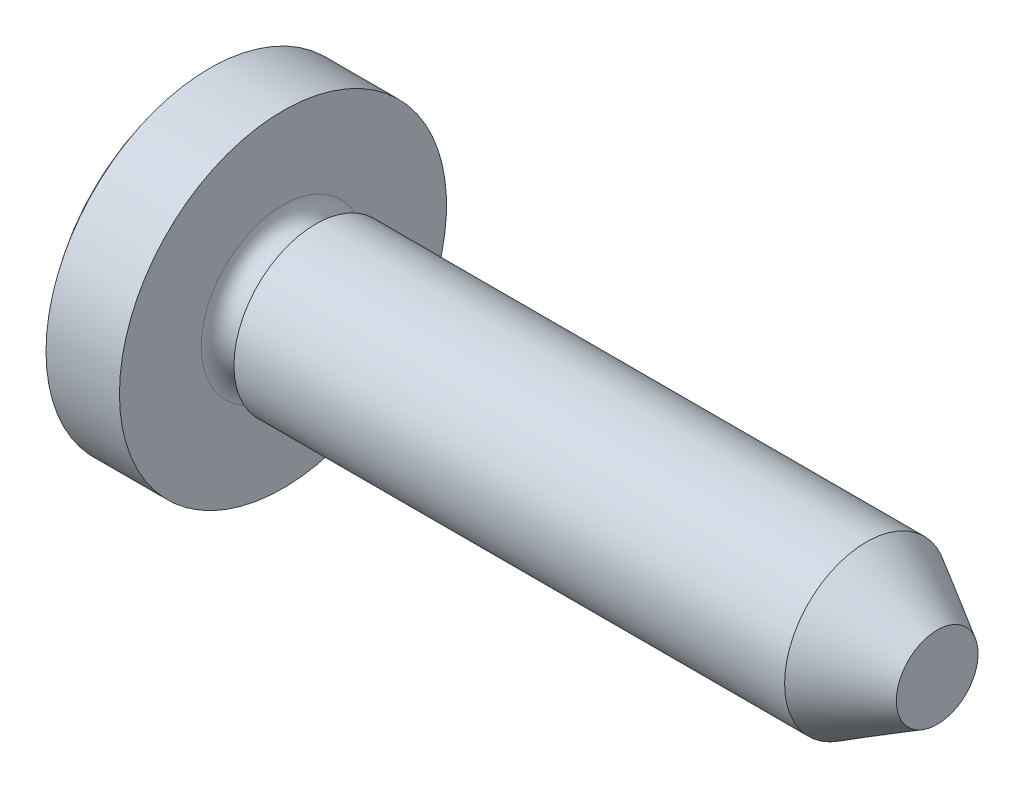
ISO-10303-21;
HEADER;
FILE_DESCRIPTION(('STEP AP214'),'2;1');
FILE_NAME('part.step','',(''),(''),'','','');
FILE_SCHEMA(('AUTOMOTIVE_DESIGN { 1 0 10303 214 1 1 1 1 }'));
ENDSEC;
DATA;
#1=APPLICATION_CONTEXT('core data for automotive mechanical design processes');
#2=APPLICATION_PROTOCOL_DEFINITION('international standard','automotive_design',2000,#1);
#3=PRODUCT_CONTEXT('',#1,'mechanical');
#4=PRODUCT('Part','Part','',(#3));
#5=PRODUCT_RELATED_PRODUCT_CATEGORY('part','',(#4));
#6=PRODUCT_DEFINITION_FORMATION('','',#4);
#7=PRODUCT_DEFINITION_CONTEXT('part definition',#1,'design');
#8=PRODUCT_DEFINITION('design','',#6,#7);
#9=PRODUCT_DEFINITION_SHAPE('','',#8);
#10=(LENGTH_UNIT() NAMED_UNIT(*) SI_UNIT(.MILLI.,.METRE.));
#11=(NAMED_UNIT(*) PLANE_ANGLE_UNIT() SI_UNIT($,.RADIAN.));
#12=(NAMED_UNIT(*) SI_UNIT($,.STERADIAN.) SOLID_ANGLE_UNIT());
#13=UNCERTAINTY_MEASURE_WITH_UNIT(LENGTH_MEASURE(1.E-05),#10,'distance_accuracy_value','');
#14=(GEOMETRIC_REPRESENTATION_CONTEXT(3) GLOBAL_UNCERTAINTY_ASSIGNED_CONTEXT((#13)) GLOBAL_UNIT_ASSIGNED_CONTEXT((#10,
#11,#12)) REPRESENTATION_CONTEXT('',''));
#15=CARTESIAN_POINT('',(0.,0.,0.));
#16=DIRECTION('',(0.,0.,1.));
#17=DIRECTION('',(1.,0.,0.));
#18=AXIS2_PLACEMENT_3D('',#15,#16,#17);
#19=CARTESIAN_POINT('',(0.9,-0.190000000000001,-0.190000000000001));
#20=DIRECTION('',(-1.,0.,0.));
#21=DIRECTION('',(0.,0.,1.));
#22=AXIS2_PLACEMENT_3D('',#19,#20,#21);
#23=PLANE('',#22);
#24=DIRECTION('',(0.,1.,0.));
#25=VECTOR('',#24,1.);
#26=CARTESIAN_POINT('',(0.9,0.,0.430384757729334));
#27=LINE('',#26,#25);
#28=CARTESIAN_POINT('',(0.9,0.189999999999999,0.430384757729334));
#29=VERTEX_POINT('',#28);
#30=CARTESIAN_POINT('',(0.9,-0.190000000000001,0.430384757729334));
#31=VERTEX_POINT('',#30);
#32=EDGE_CURVE('E121',#29,#31,#27,.F.);
#33=ORIENTED_EDGE('',*,*,#32,.F.);
#34=DIRECTION('',(0.,0.,-1.));
#35=VECTOR('',#34,1.);
#36=CARTESIAN_POINT('',(0.9,0.189999999999999,0.189999999999999));
#37=LINE('',#36,#35);
#38=CARTESIAN_POINT('',(0.9,0.189999999999999,0.189999999999999));
#39=VERTEX_POINT('',#38);
#40=EDGE_CURVE('E123',#39,#29,#37,.F.);
#41=ORIENTED_EDGE('',*,*,#40,.F.);
#42=DIRECTION('',(0.,1.,0.));
#43=VECTOR('',#42,1.);
#44=CARTESIAN_POINT('',(0.9,0.949999999999999,0.189999999999999));
#45=LINE('',#44,#43);
#46=CARTESIAN_POINT('',(0.9,0.430384757729334,0.189999999999999));
#47=VERTEX_POINT('',#46);
#48=EDGE_CURVE('E158',#47,#39,#45,.F.);
#49=ORIENTED_EDGE('',*,*,#48,.F.);
#50=DIRECTION('',(0.,0.,1.));
#51=VECTOR('',#50,1.);
#52=CARTESIAN_POINT('',(0.9,0.430384757729334,0.));
#53=LINE('',#52,#51);
#54=CARTESIAN_POINT('',(0.9,0.430384757729334,-0.190000000000001));
#55=VERTEX_POINT('',#54);
#56=EDGE_CURVE('E164',#55,#47,#53,.T.);
#57=ORIENTED_EDGE('',*,*,#56,.F.);
#58=DIRECTION('',(0.,-1.,0.));
#59=VECTOR('',#58,1.);
#60=CARTESIAN_POINT('',(0.9,0.949999999999999,-0.190000000000001));
#61=LINE('',#60,#59);
#62=CARTESIAN_POINT('',(0.9,0.189999999999999,-0.190000000000001));
#63=VERTEX_POINT('',#62);
#64=EDGE_CURVE('E170',#63,#55,#61,.F.);
#65=ORIENTED_EDGE('',*,*,#64,.F.);
#66=DIRECTION('',(0.,0.,-1.));
#67=VECTOR('',#66,1.);
#68=CARTESIAN_POINT('',(0.9,0.189999999999999,-0.190000000000001));
#69=LINE('',#68,#67);
#70=CARTESIAN_POINT('',(0.9,0.189999999999999,-0.430384757729336));
#71=VERTEX_POINT('',#70);
#72=EDGE_CURVE('E176',#71,#63,#69,.F.);
#73=ORIENTED_EDGE('',*,*,#72,.F.);
#74=DIRECTION('',(0.,1.,0.));
#75=VECTOR('',#74,1.);
#76=CARTESIAN_POINT('',(0.9,0.,-0.430384757729336));
#77=LINE('',#76,#75);
#78=CARTESIAN_POINT('',(0.9,-0.190000000000001,-0.430384757729336));
#79=VERTEX_POINT('',#78);
#80=EDGE_CURVE('E182',#79,#71,#77,.T.);
#81=ORIENTED_EDGE('',*,*,#80,.F.);
#82=DIRECTION('',(0.,0.,1.));
#83=VECTOR('',#82,1.);
#84=CARTESIAN_POINT('',(0.9,-0.190000000000001,-0.190000000000001));
#85=LINE('',#84,#83);
#86=CARTESIAN_POINT('',(0.9,-0.190000000000001,-0.190000000000001));
#87=VERTEX_POINT('',#86);
#88=EDGE_CURVE('E188',#87,#79,#85,.F.);
#89=ORIENTED_EDGE('',*,*,#88,.F.);
#90=DIRECTION('',(0.,1.,0.));
#91=VECTOR('',#90,1.);
#92=CARTESIAN_POINT('',(0.9,-0.95,-0.190000000000001));
#93=LINE('',#92,#91);
#94=CARTESIAN_POINT('',(0.9,-0.430384757729336,-0.190000000000001));
#95=VERTEX_POINT('',#94);
#96=EDGE_CURVE('E194',#95,#87,#93,.T.);
#97=ORIENTED_EDGE('',*,*,#96,.F.);
#98=DIRECTION('',(0.,0.,1.));
#99=VECTOR('',#98,1.);
#100=CARTESIAN_POINT('',(0.9,-0.430384757729336,0.));
#101=LINE('',#100,#99);
#102=CARTESIAN_POINT('',(0.9,-0.430384757729336,0.189999999999999));
#103=VERTEX_POINT('',#102);
#104=EDGE_CURVE('E200',#103,#95,#101,.F.);
#105=ORIENTED_EDGE('',*,*,#104,.F.);
#106=DIRECTION('',(0.,1.,0.));
#107=VECTOR('',#106,1.);
#108=CARTESIAN_POINT('',(0.9,-0.95,0.189999999999999));
#109=LINE('',#108,#107);
#110=CARTESIAN_POINT('',(0.9,-0.190000000000001,0.189999999999999));
#111=VERTEX_POINT('',#110);
#112=EDGE_CURVE('E89',#111,#103,#109,.F.);
#113=ORIENTED_EDGE('',*,*,#112,.F.);
#114=DIRECTION('',(0.,0.,1.));
#115=VECTOR('',#114,1.);
#116=CARTESIAN_POINT('',(0.9,-0.190000000000001,0.189999999999999));
#117=LINE('',#116,#115);
#118=EDGE_CURVE('E126',#31,#111,#117,.F.);
#119=ORIENTED_EDGE('',*,*,#118,.F.);
#120=EDGE_LOOP('',(#33,#41,#49,#57,#65,#73,#81,#89,#97,#105,#113,#119));
#121=FACE_BOUND('',#120,.T.);
#122=ADVANCED_FACE('F17',(#121),#23,.T.);
#123=CARTESIAN_POINT('',(0.9,-0.95,0.189999999999999));
#124=DIRECTION('',(0.,0.,-1.));
#125=DIRECTION('',(0.,1.,0.));
#126=AXIS2_PLACEMENT_3D('',#123,#124,#125);
#127=PLANE('',#126);
#128=CARTESIAN_POINT('',(3.2,0.,0.189999999999999));
#129=DIRECTION('',(0.,0.,-1.));
#130=DIRECTION('',(0.,1.,0.));
#131=AXIS2_PLACEMENT_3D('',#128,#129,#130);
#132=CIRCLE('',#131,3.19435439486604);
#133=CARTESIAN_POINT('',(0.0113012058207825,-0.190000000000001,0.189999999999999));
#134=VERTEX_POINT('',#133);
#135=CARTESIAN_POINT('',(0.128116518841079,-0.876031893359466,0.189999999999999));
#136=VERTEX_POINT('',#135);
#137=EDGE_CURVE('E21',#134,#136,#132,.F.);
#138=ORIENTED_EDGE('',*,*,#137,.F.);
#139=DIRECTION('',(1.,0.,0.));
#140=VECTOR('',#139,1.);
#141=CARTESIAN_POINT('',(0.9,-0.190000000000001,0.189999999999999));
#142=LINE('',#141,#140);
#143=EDGE_CURVE('E145',#111,#134,#142,.F.);
#144=ORIENTED_EDGE('',*,*,#143,.F.);
#145=ORIENTED_EDGE('',*,*,#112,.T.);
#146=DIRECTION('',(-0.866025403784438,-0.500000000000001,0.));
#147=VECTOR('',#146,1.);
#148=CARTESIAN_POINT('',(0.,-0.95,0.189999999999999));
#149=LINE('',#148,#147);
#150=EDGE_CURVE('E197',#136,#103,#149,.F.);
#151=ORIENTED_EDGE('',*,*,#150,.F.);
#152=EDGE_LOOP('',(#138,#144,#145,#151));
#153=FACE_BOUND('',#152,.T.);
#154=ADVANCED_FACE('F396',(#153),#127,.T.);
#155=CARTESIAN_POINT('',(0.,-0.95,0.));
#156=DIRECTION('',(-0.500000000000001,0.866025403784438,0.));
#157=DIRECTION('',(-0.866025403784438,-0.500000000000001,0.));
#158=AXIS2_PLACEMENT_3D('',#155,#156,#157);
#159=PLANE('',#158);
#160=CARTESIAN_POINT('',(0.12811651884108,-0.876031893359465,0.189999999999999));
#161=CARTESIAN_POINT('',(0.127696458565469,-0.87627441535174,0.182090361900919));
#162=CARTESIAN_POINT('',(0.127302630059771,-0.876501793480253,0.174178866378127));
#163=CARTESIAN_POINT('',(0.126567512899637,-0.876926216718351,0.158353828927159));
#164=CARTESIAN_POINT('',(0.126226216258461,-0.877123266438949,0.150440287493657));
#165=CARTESIAN_POINT('',(0.125596151606735,-0.877487038107024,0.134611432198364));
#166=CARTESIAN_POINT('',(0.125307376876867,-0.877653763933946,0.126696118693191));
#167=CARTESIAN_POINT('',(0.124782346119814,-0.877956892881802,0.11086399261485));
#168=CARTESIAN_POINT('',(0.124546084642914,-0.878093299149235,0.102947180282651));
#169=CARTESIAN_POINT('',(0.124126072798222,-0.878335793118006,0.0871123293395878));
#170=CARTESIAN_POINT('',(0.123942318252018,-0.878441883231851,0.0791942908764983));
#171=CARTESIAN_POINT('',(0.123627314678508,-0.878623748353233,0.0633572600239566));
#172=CARTESIAN_POINT('',(0.123496062745486,-0.878699525038442,0.0554382677115654));
#173=CARTESIAN_POINT('',(0.123286061162238,-0.878820765830027,0.0395996011840115));
#174=CARTESIAN_POINT('',(0.123207309880024,-0.878866230878642,0.0316799269976994));
#175=CARTESIAN_POINT('',(0.123102307697487,-0.878926850744165,0.015840168540937));
#176=CARTESIAN_POINT('',(0.12307605643962,-0.878942005767494,0.00792008427364675));
#177=CARTESIAN_POINT('',(0.123076056971174,-0.878942005376895,0.));
#178=B_SPLINE_CURVE_WITH_KNOTS('',3,(#160,#161,#162,#163,#164,#165,#166,#167,#168,#169,#170,
#171,#172,#173,#174,#175,#176,#177),.UNSPECIFIED.,.F.,.F.,(4,2,2,2,2,2,2,2,4),(0.,
0.0237734309318834,0.0475432438662146,0.0713100137002664,0.0950743159163551,0.118836726483031,
0.142597821756137,0.166358178379777,0.190118373187192),.UNSPECIFIED.);
#179=CARTESIAN_POINT('',(0.123076056971174,-0.878942005376895,0.));
#180=VERTEX_POINT('',#179);
#181=EDGE_CURVE('E243',#136,#180,#178,.T.);
#182=ORIENTED_EDGE('',*,*,#181,.F.);
#183=ORIENTED_EDGE('',*,*,#150,.T.);
#184=ORIENTED_EDGE('',*,*,#104,.T.);
#185=DIRECTION('',(0.866025403784438,0.500000000000001,0.));
#186=VECTOR('',#185,1.);
#187=CARTESIAN_POINT('',(0.128116518841079,-0.876031893359466,-0.190000000000001));
#188=LINE('',#187,#186);
#189=CARTESIAN_POINT('',(0.128116518841079,-0.876031893359466,-0.190000000000001));
#190=VERTEX_POINT('',#189);
#191=EDGE_CURVE('E191',#190,#95,#188,.T.);
#192=ORIENTED_EDGE('',*,*,#191,.F.);
#193=CARTESIAN_POINT('',(0.123076056971174,-0.878942005376895,0.));
#194=CARTESIAN_POINT('',(0.12307605643962,-0.878942005767494,-0.00792008427364706));
#195=CARTESIAN_POINT('',(0.123102307697486,-0.878926850744165,-0.0158401685409374));
#196=CARTESIAN_POINT('',(0.123207309880024,-0.878866230878642,-0.0316799269976996));
#197=CARTESIAN_POINT('',(0.123286061162238,-0.878820765830027,-0.0395996011840114));
#198=CARTESIAN_POINT('',(0.123496062745487,-0.878699525038442,-0.0554382677115652));
#199=CARTESIAN_POINT('',(0.123627314678508,-0.878623748353233,-0.0633572600239565));
#200=CARTESIAN_POINT('',(0.123942318252018,-0.878441883231851,-0.0791942908764983));
#201=CARTESIAN_POINT('',(0.124126072798222,-0.878335793118006,-0.0871123293395875));
#202=CARTESIAN_POINT('',(0.124546084642914,-0.878093299149235,-0.102947180282651));
#203=CARTESIAN_POINT('',(0.124782346119814,-0.877956892881802,-0.11086399261485));
#204=CARTESIAN_POINT('',(0.125307376876867,-0.877653763933946,-0.126696118693192));
#205=CARTESIAN_POINT('',(0.125596151606735,-0.877487038107024,-0.134611432198365));
#206=CARTESIAN_POINT('',(0.126226216258461,-0.877123266438949,-0.150440287493658));
#207=CARTESIAN_POINT('',(0.126567512899637,-0.876926216718351,-0.158353828927161));
#208=CARTESIAN_POINT('',(0.127302630059771,-0.876501793480253,-0.174178866378128));
#209=CARTESIAN_POINT('',(0.127696458565469,-0.87627441535174,-0.182090361900921));
#210=CARTESIAN_POINT('',(0.12811651884108,-0.876031893359465,-0.190000000000001));
#211=B_SPLINE_CURVE_WITH_KNOTS('',3,(#193,#194,#195,#196,#197,#198,#199,#200,#201,#202,#203,
#204,#205,#206,#207,#208,#209,#210),.UNSPECIFIED.,.F.,.F.,(4,2,2,2,2,2,2,2,4),(0.,
0.0237601948074149,0.0475205514310539,0.0712816467041611,0.0950440572708361,0.118808359486926,
0.142575129320978,0.16634494225531,0.190118373187194),.UNSPECIFIED.);
#212=EDGE_CURVE('E248',#180,#190,#211,.T.);
#213=ORIENTED_EDGE('',*,*,#212,.F.);
#214=EDGE_LOOP('',(#182,#183,#184,#192,#213));
#215=FACE_BOUND('',#214,.T.);
#216=ADVANCED_FACE('F305',(#215),#159,.T.);
#217=CARTESIAN_POINT('',(0.9,-0.95,-0.190000000000001));
#218=DIRECTION('',(0.,0.,1.));
#219=DIRECTION('',(1.,0.,0.));
#220=AXIS2_PLACEMENT_3D('',#217,#218,#219);
#221=PLANE('',#220);
#222=CARTESIAN_POINT('',(3.2,0.,-0.190000000000001));
#223=DIRECTION('',(0.,0.,1.));
#224=DIRECTION('',(1.,0.,0.));
#225=AXIS2_PLACEMENT_3D('',#222,#223,#224);
#226=CIRCLE('',#225,3.19435439486604);
#227=CARTESIAN_POINT('',(0.0113012058207825,-0.190000000000001,-0.190000000000001));
#228=VERTEX_POINT('',#227);
#229=EDGE_CURVE('E298',#190,#228,#226,.F.);
#230=ORIENTED_EDGE('',*,*,#229,.F.);
#231=ORIENTED_EDGE('',*,*,#191,.T.);
#232=ORIENTED_EDGE('',*,*,#96,.T.);
#233=DIRECTION('',(1.,0.,0.));
#234=VECTOR('',#233,1.);
#235=CARTESIAN_POINT('',(0.9,-0.190000000000001,-0.190000000000001));
#236=LINE('',#235,#234);
#237=EDGE_CURVE('E185',#228,#87,#236,.T.);
#238=ORIENTED_EDGE('',*,*,#237,.F.);
#239=EDGE_LOOP('',(#230,#231,#232,#238));
#240=FACE_BOUND('',#239,.T.);
#241=ADVANCED_FACE('F307',(#240),#221,.T.);
#242=CARTESIAN_POINT('',(0.9,-0.190000000000001,-0.190000000000001));
#243=DIRECTION('',(0.,1.,0.));
#244=DIRECTION('',(0.,0.,1.));
#245=AXIS2_PLACEMENT_3D('',#242,#243,#244);
#246=PLANE('',#245);
#247=CARTESIAN_POINT('',(3.2,-0.190000000000001,0.));
#248=DIRECTION('',(0.,1.,0.));
#249=DIRECTION('',(0.,0.,1.));
#250=AXIS2_PLACEMENT_3D('',#247,#248,#249);
#251=CIRCLE('',#250,3.19435439486604);
#252=CARTESIAN_POINT('',(0.128116518841083,-0.190000000000001,-0.876031893359463));
#253=VERTEX_POINT('',#252);
#254=EDGE_CURVE('E296',#228,#253,#251,.F.);
#255=ORIENTED_EDGE('',*,*,#254,.F.);
#256=ORIENTED_EDGE('',*,*,#237,.T.);
#257=ORIENTED_EDGE('',*,*,#88,.T.);
#258=DIRECTION('',(0.866025403784438,0.,0.500000000000001));
#259=VECTOR('',#258,1.);
#260=CARTESIAN_POINT('',(0.,-0.190000000000001,-0.95));
#261=LINE('',#260,#259);
#262=EDGE_CURVE('E179',#253,#79,#261,.T.);
#263=ORIENTED_EDGE('',*,*,#262,.F.);
#264=EDGE_LOOP('',(#255,#256,#257,#263));
#265=FACE_BOUND('',#264,.T.);
#266=ADVANCED_FACE('F310',(#265),#246,.T.);
#267=CARTESIAN_POINT('',(0.,0.,-0.95));
#268=DIRECTION('',(-0.500000000000001,0.,0.866025403784438));
#269=DIRECTION('',(0.866025403784438,0.,0.500000000000001));
#270=AXIS2_PLACEMENT_3D('',#267,#268,#269);
#271=PLANE('',#270);
#272=CARTESIAN_POINT('',(2.81136206679761,0.,0.673140646055105));
#273=DIRECTION('',(-0.500000000000001,0.,0.866025403784438));
#274=DIRECTION('',(0.866025403784438,0.,0.500000000000001));
#275=AXIS2_PLACEMENT_3D('',#272,#273,#274);
#276=CIRCLE('',#275,3.10416530286399);
#277=CARTESIAN_POINT('',(0.128116518841084,0.189999999999999,-0.876031893359462));
#278=VERTEX_POINT('',#277);
#279=EDGE_CURVE('E289',#253,#278,#276,.F.);
#280=ORIENTED_EDGE('',*,*,#279,.F.);
#281=ORIENTED_EDGE('',*,*,#262,.T.);
#282=ORIENTED_EDGE('',*,*,#80,.T.);
#283=DIRECTION('',(0.866025403784438,0.,0.500000000000001));
#284=VECTOR('',#283,1.);
#285=CARTESIAN_POINT('',(0.128116518841083,0.189999999999999,-0.876031893359463));
#286=LINE('',#285,#284);
#287=EDGE_CURVE('E173',#278,#71,#286,.T.);
#288=ORIENTED_EDGE('',*,*,#287,.F.);
#289=EDGE_LOOP('',(#280,#281,#282,#288));
#290=FACE_BOUND('',#289,.T.);
#291=ADVANCED_FACE('F314',(#290),#271,.T.);
#292=CARTESIAN_POINT('',(0.9,0.189999999999999,-0.190000000000001));
#293=DIRECTION('',(0.,-1.,0.));
#294=DIRECTION('',(0.,0.,-1.));
#295=AXIS2_PLACEMENT_3D('',#292,#293,#294);
#296=PLANE('',#295);
#297=CARTESIAN_POINT('',(3.2,0.189999999999999,0.));
#298=DIRECTION('',(0.,1.,0.));
#299=DIRECTION('',(0.,0.,1.));
#300=AXIS2_PLACEMENT_3D('',#297,#298,#299);
#301=CIRCLE('',#300,3.19435439486604);
#302=CARTESIAN_POINT('',(0.0113012058207844,0.189999999999999,-0.190000000000001));
#303=VERTEX_POINT('',#302);
#304=EDGE_CURVE('E285',#278,#303,#301,.T.);
#305=ORIENTED_EDGE('',*,*,#304,.F.);
#306=ORIENTED_EDGE('',*,*,#287,.T.);
#307=ORIENTED_EDGE('',*,*,#72,.T.);
#308=DIRECTION('',(1.,0.,0.));
#309=VECTOR('',#308,1.);
#310=CARTESIAN_POINT('',(0.9,0.189999999999999,-0.190000000000001));
#311=LINE('',#310,#309);
#312=EDGE_CURVE('E167',#303,#63,#311,.T.);
#313=ORIENTED_EDGE('',*,*,#312,.F.);
#314=EDGE_LOOP('',(#305,#306,#307,#313));
#315=FACE_BOUND('',#314,.T.);
#316=ADVANCED_FACE('F316',(#315),#296,.T.);
#317=CARTESIAN_POINT('',(0.9,0.949999999999999,-0.190000000000001));
#318=DIRECTION('',(0.,0.,1.));
#319=DIRECTION('',(0.,-1.,0.));
#320=AXIS2_PLACEMENT_3D('',#317,#318,#319);
#321=PLANE('',#320);
#322=CARTESIAN_POINT('',(3.2,0.,-0.190000000000001));
#323=DIRECTION('',(0.,0.,1.));
#324=DIRECTION('',(0.,-1.,0.));
#325=AXIS2_PLACEMENT_3D('',#322,#323,#324);
#326=CIRCLE('',#325,3.19435439486604);
#327=CARTESIAN_POINT('',(0.128116518841086,0.87603189335946,-0.190000000000001));
#328=VERTEX_POINT('',#327);
#329=EDGE_CURVE('E275',#303,#328,#326,.F.);
#330=ORIENTED_EDGE('',*,*,#329,.F.);
#331=ORIENTED_EDGE('',*,*,#312,.T.);
#332=ORIENTED_EDGE('',*,*,#64,.T.);
#333=DIRECTION('',(0.866025403784438,-0.500000000000001,0.));
#334=VECTOR('',#333,1.);
#335=CARTESIAN_POINT('',(0.,0.949999999999999,-0.190000000000001));
#336=LINE('',#335,#334);
#337=EDGE_CURVE('E161',#328,#55,#336,.T.);
#338=ORIENTED_EDGE('',*,*,#337,.F.);
#339=EDGE_LOOP('',(#330,#331,#332,#338));
#340=FACE_BOUND('',#339,.T.);
#341=ADVANCED_FACE('F318',(#340),#321,.T.);
#342=CARTESIAN_POINT('',(0.,0.949999999999999,0.));
#343=DIRECTION('',(-0.500000000000001,-0.866025403784438,0.));
#344=DIRECTION('',(0.866025403784438,-0.500000000000001,0.));
#345=AXIS2_PLACEMENT_3D('',#342,#343,#344);
#346=PLANE('',#345);
#347=CARTESIAN_POINT('',(0.128116518841087,0.87603189335946,-0.190000000000001));
#348=CARTESIAN_POINT('',(0.127696458565477,0.876274415351735,-0.182090361900921));
#349=CARTESIAN_POINT('',(0.127302630059779,0.876501793480247,-0.174178866378128));
#350=CARTESIAN_POINT('',(0.126567512899644,0.876926216718345,-0.158353828927161));
#351=CARTESIAN_POINT('',(0.126226216258468,0.877123266438943,-0.150440287493658));
#352=CARTESIAN_POINT('',(0.125596151606742,0.877487038107019,-0.134611432198365));
#353=CARTESIAN_POINT('',(0.125307376876874,0.877653763933941,-0.126696118693192));
#354=CARTESIAN_POINT('',(0.124782346119821,0.877956892881796,-0.110863992614851));
#355=CARTESIAN_POINT('',(0.124546084642921,0.87809329914923,-0.102947180282652));
#356=CARTESIAN_POINT('',(0.124126072798229,0.878335793118,-0.0871123293395883));
#357=CARTESIAN_POINT('',(0.123942318252025,0.878441883231845,-0.0791942908764989));
#358=CARTESIAN_POINT('',(0.123627314678515,0.878623748353227,-0.063357260023957));
#359=CARTESIAN_POINT('',(0.123496062745494,0.878699525038436,-0.0554382677115656));
#360=CARTESIAN_POINT('',(0.123286061162245,0.878820765830021,-0.0395996011840116));
#361=CARTESIAN_POINT('',(0.123207309880031,0.878866230878637,-0.0316799269976997));
#362=CARTESIAN_POINT('',(0.123102307697494,0.87892685074416,-0.0158401685409373));
#363=CARTESIAN_POINT('',(0.123076056439627,0.878942005767488,-0.00792008427364691));
#364=CARTESIAN_POINT('',(0.123076056971182,0.87894200537689,0.));
#365=B_SPLINE_CURVE_WITH_KNOTS('',3,(#347,#348,#349,#350,#351,#352,#353,#354,#355,#356,#357,
#358,#359,#360,#361,#362,#363,#364),.UNSPECIFIED.,.F.,.F.,(4,2,2,2,2,2,2,2,4),(0.,
0.0237734309318837,0.0475432438662153,0.0713100137002674,0.0950743159163566,0.118836726483032,
0.142597821756139,0.166358178379779,0.190118373187194),.UNSPECIFIED.);
#366=CARTESIAN_POINT('',(0.123076056971182,0.87894200537689,0.));
#367=VERTEX_POINT('',#366);
#368=EDGE_CURVE('E272',#328,#367,#365,.T.);
#369=ORIENTED_EDGE('',*,*,#368,.F.);
#370=ORIENTED_EDGE('',*,*,#337,.T.);
#371=ORIENTED_EDGE('',*,*,#56,.T.);
#372=DIRECTION('',(0.866025403784438,-0.500000000000001,0.));
#373=VECTOR('',#372,1.);
#374=CARTESIAN_POINT('',(0.128116518841086,0.87603189335946,0.189999999999999));
#375=LINE('',#374,#373);
#376=CARTESIAN_POINT('',(0.128116518841086,0.87603189335946,0.189999999999999));
#377=VERTEX_POINT('',#376);
#378=EDGE_CURVE('E138',#377,#47,#375,.T.);
#379=ORIENTED_EDGE('',*,*,#378,.F.);
#380=CARTESIAN_POINT('',(0.123076056971182,0.87894200537689,0.));
#381=CARTESIAN_POINT('',(0.123076056439627,0.878942005767488,0.00792008427364669));
#382=CARTESIAN_POINT('',(0.123102307697494,0.87892685074416,0.0158401685409367));
#383=CARTESIAN_POINT('',(0.123207309880031,0.878866230878637,0.0316799269976985));
#384=CARTESIAN_POINT('',(0.123286061162245,0.878820765830021,0.0395996011840103));
#385=CARTESIAN_POINT('',(0.123496062745494,0.878699525038436,0.0554382677115638));
#386=CARTESIAN_POINT('',(0.123627314678515,0.878623748353227,0.0633572600239547));
#387=CARTESIAN_POINT('',(0.123942318252025,0.878441883231845,0.0791942908764961));
#388=CARTESIAN_POINT('',(0.12412607279823,0.878335793118,0.0871123293395855));
#389=CARTESIAN_POINT('',(0.124546084642922,0.878093299149229,0.102947180282649));
#390=CARTESIAN_POINT('',(0.124782346119821,0.877956892881796,0.110863992614848));
#391=CARTESIAN_POINT('',(0.125307376876874,0.877653763933941,0.126696118693189));
#392=CARTESIAN_POINT('',(0.125596151606742,0.877487038107019,0.134611432198362));
#393=CARTESIAN_POINT('',(0.126226216258468,0.877123266438943,0.150440287493655));
#394=CARTESIAN_POINT('',(0.126567512899644,0.876926216718345,0.158353828927158));
#395=CARTESIAN_POINT('',(0.127302630059779,0.876501793480247,0.174178866378126));
#396=CARTESIAN_POINT('',(0.127696458565477,0.876274415351735,0.18209036190092));
#397=CARTESIAN_POINT('',(0.128116518841087,0.87603189335946,0.19));
#398=B_SPLINE_CURVE_WITH_KNOTS('',3,(#380,#381,#382,#383,#384,#385,#386,#387,#388,#389,#390,
#391,#392,#393,#394,#395,#396,#397),.UNSPECIFIED.,.F.,.F.,(4,2,2,2,2,2,2,2,4),(0.,
0.0237601948074139,0.0475205514310529,0.0712816467041589,0.0950440572708342,0.118808359486923,
0.142575129320976,0.166344942255308,0.190118373187192),.UNSPECIFIED.);
#399=EDGE_CURVE('E268',#367,#377,#398,.T.);
#400=ORIENTED_EDGE('',*,*,#399,.F.);
#401=EDGE_LOOP('',(#369,#370,#371,#379,#400));
#402=FACE_BOUND('',#401,.T.);
#403=ADVANCED_FACE('F320',(#402),#346,.T.);
#404=CARTESIAN_POINT('',(0.9,0.949999999999999,0.189999999999999));
#405=DIRECTION('',(0.,0.,-1.));
#406=DIRECTION('',(0.,1.,0.));
#407=AXIS2_PLACEMENT_3D('',#404,#405,#406);
#408=PLANE('',#407);
#409=CARTESIAN_POINT('',(3.2,0.,0.189999999999999));
#410=DIRECTION('',(0.,0.,-1.));
#411=DIRECTION('',(0.,1.,0.));
#412=AXIS2_PLACEMENT_3D('',#409,#410,#411);
#413=CIRCLE('',#412,3.19435439486604);
#414=CARTESIAN_POINT('',(0.0113012058207844,0.189999999999999,0.189999999999999));
#415=VERTEX_POINT('',#414);
#416=EDGE_CURVE('E284',#377,#415,#413,.F.);
#417=ORIENTED_EDGE('',*,*,#416,.F.);
#418=ORIENTED_EDGE('',*,*,#378,.T.);
#419=ORIENTED_EDGE('',*,*,#48,.T.);
#420=DIRECTION('',(1.,0.,0.));
#421=VECTOR('',#420,1.);
#422=CARTESIAN_POINT('',(0.9,0.189999999999999,0.189999999999999));
#423=LINE('',#422,#421);
#424=EDGE_CURVE('E131',#415,#39,#423,.T.);
#425=ORIENTED_EDGE('',*,*,#424,.F.);
#426=EDGE_LOOP('',(#417,#418,#419,#425));
#427=FACE_BOUND('',#426,.T.);
#428=ADVANCED_FACE('F380',(#427),#408,.T.);
#429=CARTESIAN_POINT('',(0.9,0.189999999999999,0.189999999999999));
#430=DIRECTION('',(0.,-1.,0.));
#431=DIRECTION('',(0.,0.,-1.));
#432=AXIS2_PLACEMENT_3D('',#429,#430,#431);
#433=PLANE('',#432);
#434=CARTESIAN_POINT('',(3.2,0.189999999999999,0.));
#435=DIRECTION('',(0.,1.,0.));
#436=DIRECTION('',(0.,0.,1.));
#437=AXIS2_PLACEMENT_3D('',#434,#435,#436);
#438=CIRCLE('',#437,3.19435439486604);
#439=CARTESIAN_POINT('',(0.128116518841084,0.189999999999999,0.876031893359461));
#440=VERTEX_POINT('',#439);
#441=EDGE_CURVE('E323',#415,#440,#438,.T.);
#442=ORIENTED_EDGE('',*,*,#441,.F.);
#443=ORIENTED_EDGE('',*,*,#424,.T.);
#444=ORIENTED_EDGE('',*,*,#40,.T.);
#445=DIRECTION('',(-0.866025403784438,0.,0.500000000000001));
#446=VECTOR('',#445,1.);
#447=CARTESIAN_POINT('',(0.,0.189999999999999,0.949999999999999));
#448=LINE('',#447,#446);
#449=EDGE_CURVE('E130',#440,#29,#448,.F.);
#450=ORIENTED_EDGE('',*,*,#449,.F.);
#451=EDGE_LOOP('',(#442,#443,#444,#450));
#452=FACE_BOUND('',#451,.T.);
#453=ADVANCED_FACE('F136',(#452),#433,.T.);
#454=CARTESIAN_POINT('',(0.,0.,0.949999999999999));
#455=DIRECTION('',(-0.500000000000001,0.,-0.866025403784438));
#456=DIRECTION('',(-0.866025403784438,0.,0.500000000000001));
#457=AXIS2_PLACEMENT_3D('',#454,#455,#456);
#458=PLANE('',#457);
#459=CARTESIAN_POINT('',(2.81136206679761,0.,-0.673140646055106));
#460=DIRECTION('',(-0.500000000000001,0.,-0.866025403784438));
#461=DIRECTION('',(-0.866025403784438,0.,0.500000000000001));
#462=AXIS2_PLACEMENT_3D('',#459,#460,#461);
#463=CIRCLE('',#462,3.10416530286399);
#464=CARTESIAN_POINT('',(0.128116518841082,-0.190000000000001,0.876031893359462));
#465=VERTEX_POINT('',#464);
#466=EDGE_CURVE('E142',#440,#465,#463,.F.);
#467=ORIENTED_EDGE('',*,*,#466,.F.);
#468=ORIENTED_EDGE('',*,*,#449,.T.);
#469=ORIENTED_EDGE('',*,*,#32,.T.);
#470=DIRECTION('',(0.866025403784438,0.,-0.500000000000001));
#471=VECTOR('',#470,1.);
#472=CARTESIAN_POINT('',(0.128116518841081,-0.190000000000001,0.876031893359463));
#473=LINE('',#472,#471);
#474=EDGE_CURVE('E538',#465,#31,#473,.T.);
#475=ORIENTED_EDGE('',*,*,#474,.F.);
#476=EDGE_LOOP('',(#467,#468,#469,#475));
#477=FACE_BOUND('',#476,.T.);
#478=ADVANCED_FACE('F140',(#477),#458,.T.);
#479=CARTESIAN_POINT('',(0.9,-0.190000000000001,0.189999999999999));
#480=DIRECTION('',(0.,1.,0.));
#481=DIRECTION('',(0.,0.,1.));
#482=AXIS2_PLACEMENT_3D('',#479,#480,#481);
#483=PLANE('',#482);
#484=CARTESIAN_POINT('',(3.2,-0.190000000000001,0.));
#485=DIRECTION('',(0.,1.,0.));
#486=DIRECTION('',(0.,0.,1.));
#487=AXIS2_PLACEMENT_3D('',#484,#485,#486);
#488=CIRCLE('',#487,3.19435439486604);
#489=EDGE_CURVE('E325',#465,#134,#488,.F.);
#490=ORIENTED_EDGE('',*,*,#489,.F.);
#491=ORIENTED_EDGE('',*,*,#474,.T.);
#492=ORIENTED_EDGE('',*,*,#118,.T.);
#493=ORIENTED_EDGE('',*,*,#143,.T.);
#494=EDGE_LOOP('',(#490,#491,#492,#493));
#495=FACE_BOUND('',#494,.T.);
#496=ADVANCED_FACE('F261',(#495),#483,.T.);
#497=CARTESIAN_POINT('',(3.2,0.,0.));
#498=DIRECTION('',(0.,1.,0.));
#499=DIRECTION('',(-0.773662207492832,0.,-0.633598286532814));
#500=AXIS2_PLACEMENT_3D('',#497,#498,#499);
#501=SPHERICAL_SURFACE('',#500,3.2);
#502=ORIENTED_EDGE('',*,*,#466,.T.);
#503=ORIENTED_EDGE('',*,*,#489,.T.);
#504=ORIENTED_EDGE('',*,*,#137,.T.);
#505=ORIENTED_EDGE('',*,*,#181,.T.);
#506=ORIENTED_EDGE('',*,*,#212,.T.);
#507=ORIENTED_EDGE('',*,*,#229,.T.);
#508=ORIENTED_EDGE('',*,*,#254,.T.);
#509=ORIENTED_EDGE('',*,*,#279,.T.);
#510=ORIENTED_EDGE('',*,*,#304,.T.);
#511=ORIENTED_EDGE('',*,*,#329,.T.);
#512=ORIENTED_EDGE('',*,*,#368,.T.);
#513=ORIENTED_EDGE('',*,*,#399,.T.);
#514=ORIENTED_EDGE('',*,*,#416,.T.);
#515=ORIENTED_EDGE('',*,*,#441,.T.);
#516=EDGE_LOOP('',(#502,#503,#504,#505,#506,#507,#508,#509,#510,#511,#512,#513,#514,#515));
#517=FACE_BOUND('',#516,.T.);
#518=CARTESIAN_POINT('',(0.702000800640645,0.,0.));
#519=DIRECTION('',(-1.,0.,0.));
#520=DIRECTION('',(0.,0.,1.));
#521=AXIS2_PLACEMENT_3D('',#518,#519,#520);
#522=CIRCLE('',#521,1.99999999999998);
#523=CARTESIAN_POINT('',(0.702000800640645,0.,1.99999999999998));
#524=VERTEX_POINT('',#523);
#525=EDGE_CURVE('E330',#524,#524,#522,.F.);
#526=ORIENTED_EDGE('',*,*,#525,.F.);
#527=EDGE_LOOP('',(#526));
#528=FACE_BOUND('',#527,.T.);
#529=ADVANCED_FACE('F251',(#517,#528),#501,.T.);
#530=CARTESIAN_POINT('',(-96.3851955307263,0.,0.));
#531=DIRECTION('',(-1.,0.,0.));
#532=DIRECTION('',(0.,0.,1.));
#533=AXIS2_PLACEMENT_3D('',#530,#531,#532);
#534=CYLINDRICAL_SURFACE('',#533,1.99999999999998);
#535=ORIENTED_EDGE('',*,*,#525,.T.);
#536=EDGE_LOOP('',(#535));
#537=FACE_BOUND('',#536,.T.);
#538=CARTESIAN_POINT('',(1.6,0.,0.));
#539=DIRECTION('',(-1.,0.,0.));
#540=DIRECTION('',(0.,0.,1.));
#541=AXIS2_PLACEMENT_3D('',#538,#539,#540);
#542=CIRCLE('',#541,1.99999999999998);
#543=CARTESIAN_POINT('',(1.6,0.,1.99999999999998));
#544=VERTEX_POINT('',#543);
#545=EDGE_CURVE('E333',#544,#544,#542,.T.);
#546=ORIENTED_EDGE('',*,*,#545,.T.);
#547=EDGE_LOOP('',(#546));
#548=FACE_BOUND('',#547,.T.);
#549=ADVANCED_FACE('F260',(#537,#548),#534,.T.);
#550=CARTESIAN_POINT('',(9.6,0.,0.));
#551=DIRECTION('',(-1.,0.,0.));
#552=DIRECTION('',(0.,0.,1.));
#553=AXIS2_PLACEMENT_3D('',#550,#551,#552);
#554=PLANE('',#553);
#555=CARTESIAN_POINT('',(9.59999999997763,0.,0.));
#556=DIRECTION('',(-1.,0.,0.));
#557=DIRECTION('',(0.,0.,1.));
#558=AXIS2_PLACEMENT_3D('',#555,#556,#557);
#559=CIRCLE('',#558,0.499999999988177);
#560=CARTESIAN_POINT('',(9.59999999997763,0.,0.499999999988177));
#561=VERTEX_POINT('',#560);
#562=EDGE_CURVE('E336',#561,#561,#559,.T.);
#563=ORIENTED_EDGE('',*,*,#562,.F.);
#564=EDGE_LOOP('',(#563));
#565=FACE_BOUND('',#564,.T.);
#566=ADVANCED_FACE('F364',(#565),#554,.F.);
#567=CARTESIAN_POINT('',(1.6,0.999999999999981,0.));
#568=DIRECTION('',(-1.,0.,0.));
#569=DIRECTION('',(0.,0.,1.));
#570=AXIS2_PLACEMENT_3D('',#567,#568,#569);
#571=PLANE('',#570);
#572=ORIENTED_EDGE('',*,*,#545,.F.);
#573=EDGE_LOOP('',(#572));
#574=FACE_BOUND('',#573,.T.);
#575=CARTESIAN_POINT('',(1.6,0.,-0.999999999999981));
#576=CARTESIAN_POINT('',(1.6,0.0147827164318598,-1.00000023130445));
#577=CARTESIAN_POINT('',(1.6,0.0295654154481881,-0.99967221562624));
#578=CARTESIAN_POINT('',(1.6,0.0591017537997274,-0.998361350932993));
#579=CARTESIAN_POINT('',(1.6,0.0738553931349383,-0.997378501917955));
#580=CARTESIAN_POINT('',(1.6,0.103304587274189,-0.994759631179569));
#581=CARTESIAN_POINT('',(1.6,0.118000142078228,-0.993123609456221));
#582=CARTESIAN_POINT('',(1.60000000000001,0.147304276182275,-0.98920168313612));
#583=CARTESIAN_POINT('',(1.60000000000001,0.161912855482284,-0.986915778539367));
#584=CARTESIAN_POINT('',(1.59999999999999,0.191014297149555,-0.981698562802033));
#585=CARTESIAN_POINT('',(1.59999999999997,0.205507159516818,-0.978767251661453));
#586=CARTESIAN_POINT('',(1.60000000000004,0.234348719731279,-0.972264989356296));
#587=CARTESIAN_POINT('',(1.60000000000014,0.248697417578478,-0.968694038191719));
#588=CARTESIAN_POINT('',(1.59999999999987,0.277222240975824,-0.960919527459699));
#589=CARTESIAN_POINT('',(1.59999999999951,0.291398366525973,-0.956715967892254));
#590=CARTESIAN_POINT('',(1.6000000000005,0.319550885330816,-0.947684465749653));
#591=CARTESIAN_POINT('',(1.60000000000185,0.333527278585511,-0.942856523174497));
#592=CARTESIAN_POINT('',(1.59999999999908,0.354319877288997,-0.935153399295058));
#593=CARTESIAN_POINT('',(1.59999999999735,0.361222287790398,-0.932508734643234));
#594=CARTESIAN_POINT('',(1.60000000000287,0.375522210837041,-0.926848140437455));
#595=CARTESIAN_POINT('',(1.60000000001085,0.382914683419207,-0.923819477012962));
#596=CARTESIAN_POINT('',(1.60000000004738,0.404981186742937,-0.914472062313712));
#597=CARTESIAN_POINT('',(1.60000000008852,0.419545326897533,-0.907891509029555));
#598=CARTESIAN_POINT('',(1.60000000364077,0.448344999413153,-0.894047687326854));
#599=CARTESIAN_POINT('',(1.60000000715195,0.462580524152024,-0.88678440309231));
#600=CARTESIAN_POINT('',(1.6000000216234,0.490691893502827,-0.871589453136533));
#601=CARTESIAN_POINT('',(1.60000003258402,0.504567720925456,-0.86365775554971));
#602=CARTESIAN_POINT('',(1.60000007228802,0.52850951666773,-0.849213310559213));
#603=CARTESIAN_POINT('',(1.60000009590246,0.538660950719086,-0.842841361139949));
#604=CARTESIAN_POINT('',(1.60000016081422,0.565501493485906,-0.825303016106789));
#605=CARTESIAN_POINT('',(1.60000020328389,0.581976147351374,-0.813804724825395));
#606=CARTESIAN_POINT('',(1.60000022049812,0.610953528508573,-0.792204165882433));
#607=CARTESIAN_POINT('',(1.60000020708761,0.623591722602852,-0.782282542375426));
#608=CARTESIAN_POINT('',(1.60000015097812,0.648361630323538,-0.761827493868494));
#609=CARTESIAN_POINT('',(1.60000010828207,0.660493394166215,-0.75129412977599));
#610=CARTESIAN_POINT('',(1.60000003680838,0.684208650122372,-0.729631022878066));
#611=CARTESIAN_POINT('',(1.60000000802838,0.695792235178893,-0.718501381857867));
#612=CARTESIAN_POINT('',(1.59999999197906,0.718410848065091,-0.695722733788061));
#613=CARTESIAN_POINT('',(1.60000000467132,0.72944637401274,-0.68407421730354));
#614=CARTESIAN_POINT('',(1.60000002311774,0.752413771833801,-0.658879722362338));
#615=CARTESIAN_POINT('',(1.60000002780827,0.76428561673048,-0.645278373388123));
#616=CARTESIAN_POINT('',(1.60000008487793,0.780766007189638,-0.625185191557859));
#617=CARTESIAN_POINT('',(1.60000010909084,0.785720168500347,-0.618975825463795));
#618=CARTESIAN_POINT('',(1.60000017734115,0.806473153047578,-0.592278511600858));
#619=CARTESIAN_POINT('',(1.60000014280509,0.821514775457618,-0.571190874449689));
#620=CARTESIAN_POINT('',(1.60000011332533,0.842329297639857,-0.539494410547184));
#621=CARTESIAN_POINT('',(1.60000010708652,0.848760087977381,-0.52930741491646));
#622=CARTESIAN_POINT('',(1.60000008875056,0.863327920923961,-0.505271621400064));
#623=CARTESIAN_POINT('',(1.60000007539402,0.871319457361102,-0.491333777340368));
#624=CARTESIAN_POINT('',(1.60000004989046,0.886617651022939,-0.463089384899737));
#625=CARTESIAN_POINT('',(1.60000003774339,0.89392434537202,-0.448782856558354));
#626=CARTESIAN_POINT('',(1.60000001693087,0.907836747279751,-0.419833035190357));
#627=CARTESIAN_POINT('',(1.6000000082652,0.914442501744424,-0.405189764777995));
#628=CARTESIAN_POINT('',(1.60000000129781,0.923811345787847,-0.382999015488838));
#629=CARTESIAN_POINT('',(1.59999999998055,0.92684435012218,-0.375564401279411));
#630=CARTESIAN_POINT('',(1.60000000001786,0.932491117075375,-0.361236849904574));
#631=CARTESIAN_POINT('',(1.60000000116243,0.935118870712533,-0.354349423703265));
#632=CARTESIAN_POINT('',(1.60000000439591,0.942778875495741,-0.333605663528603));
#633=CARTESIAN_POINT('',(1.60000000628491,0.947588474090393,-0.319666407150384));
#634=CARTESIAN_POINT('',(1.60000000670993,0.956604758607679,-0.291594831739183));
#635=CARTESIAN_POINT('',(1.60000000524602,0.960811456368482,-0.277462516502949));
#636=CARTESIAN_POINT('',(1.59999999680545,0.968604534139527,-0.249027643193474));
#637=CARTESIAN_POINT('',(1.59999998982862,0.972190893364453,-0.234725079432972));
#638=CARTESIAN_POINT('',(1.60000002457568,0.977953227054033,-0.209576610805781));
#639=CARTESIAN_POINT('',(1.60000005456402,0.980257680587446,-0.198760158584346));
#640=CARTESIAN_POINT('',(1.60000007082675,0.984558068337604,-0.176429564230839));
#641=CARTESIAN_POINT('',(1.60000005452699,0.986529111261335,-0.16491062721226));
#642=CARTESIAN_POINT('',(1.60000002151997,0.991280104694112,-0.133955127402467));
#643=CARTESIAN_POINT('',(1.6000000120766,0.993698361196012,-0.114462346934622));
#644=CARTESIAN_POINT('',(1.60000000172823,0.997335145192053,-0.0758177612470851));
#645=CARTESIAN_POINT('',(1.60000000063171,0.998580005867877,-0.0566684348161311));
#646=CARTESIAN_POINT('',(1.5999999997033,0.999754991780916,-0.0250060781837841));
#647=CARTESIAN_POINT('',(1.59999999956406,0.99999193352249,-0.0125033666037962));
#648=CARTESIAN_POINT('',(1.60000000051542,1.00000953696415,0.0147826804667219));
#649=CARTESIAN_POINT('',(1.60000000183484,0.999699146623453,0.0295662765413514));
#650=CARTESIAN_POINT('',(1.60000000620219,0.998414503443428,0.0591049579515958));
#651=CARTESIAN_POINT('',(1.60000000925018,0.997440227663303,0.0738600422843076));
#652=CARTESIAN_POINT('',(1.60000001489647,0.994836314479647,0.103312601848502));
#653=CARTESIAN_POINT('',(1.60000001749476,0.993206661398242,0.118010075693339));
#654=CARTESIAN_POINT('',(1.60000002140412,0.989293452217712,0.147317937967039));
#655=CARTESIAN_POINT('',(1.60000002271518,0.987009887428226,0.161928325235904));
#656=CARTESIAN_POINT('',(1.60000002357767,0.98179386990407,0.191032825238257));
#657=CARTESIAN_POINT('',(1.60000002312908,0.97886141544464,0.205526937662578));
#658=CARTESIAN_POINT('',(1.60000002062767,0.97235336791543,0.234369974501167));
#659=CARTESIAN_POINT('',(1.60000001857485,0.968777779974306,0.248718900072261));
#660=CARTESIAN_POINT('',(1.60000001357301,0.960990583302271,0.27724266374323));
#661=CARTESIAN_POINT('',(1.60000001062402,0.956778986406683,0.291417505077287));
#662=CARTESIAN_POINT('',(1.6000000051285,0.9477284719862,0.319565627339041));
#663=CARTESIAN_POINT('',(1.60000000258196,0.942889572807279,0.333538914148091));
#664=CARTESIAN_POINT('',(1.60000000042355,0.935167022215311,0.354325008102987));
#665=CARTESIAN_POINT('',(1.59999999998099,0.93251542333189,0.361224847683359));
#666=CARTESIAN_POINT('',(1.60000000002056,0.926840881482521,0.375519519823767));
#667=CARTESIAN_POINT('',(1.60000000058028,0.923805244115027,0.382909313560668));
#668=CARTESIAN_POINT('',(1.60000000144419,0.914439989912337,0.404968165907429));
#669=CARTESIAN_POINT('',(1.60000000093343,0.907851463457434,0.41952822832189));
#670=CARTESIAN_POINT('',(1.60000000114646,0.894000375107147,0.448323596371286));
#671=CARTESIAN_POINT('',(1.60000000187024,0.886737816022639,0.46255890336022));
#672=CARTESIAN_POINT('',(1.60000000130387,0.871544817140739,0.490669166780977));
#673=CARTESIAN_POINT('',(1.60000000001363,0.863614347868284,0.504544107274336));
#674=CARTESIAN_POINT('',(1.60000006105231,0.849198142404882,0.528502821717214));
#675=CARTESIAN_POINT('',(1.60000010756264,0.842846655107482,0.538667480816895));
#676=CARTESIAN_POINT('',(1.6000001331917,0.829117101340385,0.559647219863289));
#677=CARTESIAN_POINT('',(1.60000010569729,0.821698385364569,0.570435791925711));
#678=CARTESIAN_POINT('',(1.60000007125659,0.808713495547691,0.588562783177256));
#679=CARTESIAN_POINT('',(1.6000000606348,0.803250283586405,0.59597567342022));
#680=CARTESIAN_POINT('',(1.60000003769464,0.790668553131383,0.612556629611478));
#681=CARTESIAN_POINT('',(1.60000002565494,0.783489510598756,0.621678969560636));
#682=CARTESIAN_POINT('',(1.60000000926175,0.76902932895158,0.639413369133287));
#683=CARTESIAN_POINT('',(1.60000000469904,0.761756926071424,0.648032562213696));
#684=CARTESIAN_POINT('',(1.60000000047133,0.747962682135292,0.66383896214517));
#685=CARTESIAN_POINT('',(1.60000000021216,0.741477564897442,0.67105827213722));
#686=CARTESIAN_POINT('',(1.59999999971052,0.725818901829491,0.688004075816288));
#687=CARTESIAN_POINT('',(1.59999999951136,0.716555222897382,0.697647462814785));
#688=CARTESIAN_POINT('',(1.60000000058542,0.695787280351396,0.718439312569559));
#689=CARTESIAN_POINT('',(1.60000000215802,0.684202594695974,0.729507655429131));
#690=CARTESIAN_POINT('',(1.600000007321,0.660507534443127,0.751067571670651));
#691=CARTESIAN_POINT('',(1.60000001091144,0.648397140125219,0.761559123382383));
#692=CARTESIAN_POINT('',(1.60000001756754,0.623684874003079,0.781946994471281));
#693=CARTESIAN_POINT('',(1.60000002063318,0.611082989432796,0.791843298370386));
#694=CARTESIAN_POINT('',(1.60000002524481,0.585415671553023,0.811015805128637));
#695=CARTESIAN_POINT('',(1.60000002679078,0.57235023155282,0.820291999031868));
#696=CARTESIAN_POINT('',(1.60000002780779,0.545786838537249,0.838202955902249));
#697=CARTESIAN_POINT('',(1.60000002727884,0.532288884272967,0.84683771701698));
#698=CARTESIAN_POINT('',(1.60000002432861,0.504891936614397,0.863445517972004));
#699=CARTESIAN_POINT('',(1.60000002190735,0.490992946695506,0.871418563544442));
#700=CARTESIAN_POINT('',(1.60000001600839,0.462826686703395,0.886684046459864));
#701=CARTESIAN_POINT('',(1.60000001253071,0.448559424080602,0.893976497558019));
#702=CARTESIAN_POINT('',(1.60000000604808,0.419689490983981,0.907864642035123));
#703=CARTESIAN_POINT('',(1.6000000030431,0.405086831179421,0.914460357540554));
#704=CARTESIAN_POINT('',(1.60000000050059,0.382957766848869,0.923817562278833));
#705=CARTESIAN_POINT('',(1.59999999998059,0.375543742192827,0.926847293537585));
#706=CARTESIAN_POINT('',(1.6000000000179,0.361228845560568,0.932499063478508));
#707=CARTESIAN_POINT('',(1.60000000049406,0.354333240418055,0.935134450352147));
#708=CARTESIAN_POINT('',(1.60000000122662,0.333564041114766,0.942815923498936));
#709=CARTESIAN_POINT('',(1.60000000078732,0.319606816180687,0.94763784573302));
#710=CARTESIAN_POINT('',(1.60000000087024,0.29149761750805,0.956674553233253));
#711=CARTESIAN_POINT('',(1.60000000139244,0.27734564495248,0.960889342185627));
#712=CARTESIAN_POINT('',(1.60000000179041,0.248870399928451,0.968695722587026));
#713=CARTESIAN_POINT('',(1.60000000166615,0.234547120733802,0.972287289479399));
#714=CARTESIAN_POINT('',(1.60000005474463,0.209361026470682,0.978051043836301));
#715=CARTESIAN_POINT('',(1.60000009462758,0.198528008705581,0.980353632870542));
#716=CARTESIAN_POINT('',(1.60000012392895,0.175393539217991,0.984807679309952));
#717=CARTESIAN_POINT('',(1.60000010625761,0.163081119842719,0.986902348482376));
#718=CARTESIAN_POINT('',(1.60000006546907,0.132135156648842,0.99157395044181));
#719=CARTESIAN_POINT('',(1.60000004412406,0.113457172979035,0.993858164126274));
#720=CARTESIAN_POINT('',(1.60000001335652,0.0746796549298652,0.99748910215117));
#721=CARTESIAN_POINT('',(1.60000000488148,0.0545728043380094,0.998758308870941));
#722=CARTESIAN_POINT('',(1.59999999946947,0.0229686386455386,0.999813870032757));
#723=CARTESIAN_POINT('',(1.59999999913979,0.0114836680136838,1.00000302503739));
#724=CARTESIAN_POINT('',(1.6,0.,0.999999999999981));
#725=B_SPLINE_CURVE_WITH_KNOTS('',3,(#575,#576,#577,#578,#579,#580,#581,#582,#583,#584,#585,
#586,#587,#588,#589,#590,#591,#592,#593,#594,#595,#596,#597,#598,#599,#600,#601,#602,#603,#604,
#605,#606,#607,#608,#609,#610,#611,#612,#613,#614,#615,#616,#617,#618,#619,#620,#621,#622,#623,
#624,#625,#626,#627,#628,#629,#630,#631,#632,#633,#634,#635,#636,#637,#638,#639,#640,#641,#642,
#643,#644,#645,#646,#647,#648,#649,#650,#651,#652,#653,#654,#655,#656,#657,#658,#659,#660,#661,
#662,#663,#664,#665,#666,#667,#668,#669,#670,#671,#672,#673,#674,#675,#676,#677,#678,#679,#680,
#681,#682,#683,#684,#685,#686,#687,#688,#689,#690,#691,#692,#693,#694,#695,#696,#697,#698,#699,
#700,#701,#702,#703,#704,#705,#706,#707,#708,#709,#710,#711,#712,#713,#714,#715,#716,#717,#718,
#719,#720,#721,#722,#723,#724),.UNSPECIFIED.,.F.,.F.,(4,2,2,2,2,2,2,2,2,2,2,2,2,2,2,2,2,2,2,2,2,
2,2,2,2,2,2,2,2,2,2,2,2,2,2,2,2,2,2,2,2,2,2,2,2,2,2,2,2,2,2,2,2,2,2,2,2,2,2,2,2,2,2,2,2,2,2,2,2,
2,2,2,2,2,4),(0.,0.0443444860239559,0.0886889720479118,0.133033458071868,0.177377944095824,
0.221722430119779,0.266066916143735,0.310411402167691,0.354755888191647,0.37692949400426,
0.400894042590628,0.44881986936534,0.496746806653307,0.544676030079059,0.580626628875361,
0.640854602717172,0.689038538219085,0.737217684526323,0.785388632635304,0.833514966529706,
0.887647782614809,0.911476801517531,0.989081424175369,1.02521781039675,1.0733958026956,
1.12157118181695,1.16974333506634,1.19382977657356,1.21594333115467,1.26016575782313,
1.30438731604981,1.34861035569518,1.38178114198882,1.41683211127416,1.47572412270456,
1.53326060758654,1.57076846741237,1.61511386048653,1.65946078600904,1.70380877245762,
1.74815734830968,1.79250604204244,1.8368543821331,1.88120189705896,1.92554811529754,
1.94772196848269,1.97168702856491,2.01961225055445,2.06753727269347,2.11546441088643,
2.15141399016482,2.19068013303921,2.2183031767976,2.25312082609039,2.28694649216389,
2.31605600795435,2.35616199337655,2.40421010007751,2.45226001072839,2.50031117026802,
2.54836302363485,2.59641501576712,2.64446659160307,2.69251719608099,2.74056627413952,
2.76459181832942,2.78673645470535,2.83102167398408,2.87530662437262,2.91959331931308,
2.95281183092137,2.99026963767578,3.04669101364446,3.10709329948407,3.14154566367025),.UNSPECIFIED.);
#726=CARTESIAN_POINT('',(1.6,0.,-0.999999999999982));
#727=VERTEX_POINT('',#726);
#728=CARTESIAN_POINT('',(1.6,0.,0.999999999999982));
#729=VERTEX_POINT('',#728);
#730=EDGE_CURVE('E35',#727,#729,#725,.T.);
#731=ORIENTED_EDGE('',*,*,#730,.F.);
#732=CARTESIAN_POINT('',(1.6,0.,0.999999999999981));
#733=CARTESIAN_POINT('',(1.6,-0.190217037372728,0.999999999999981));
#734=CARTESIAN_POINT('',(1.6,-0.368094709561864,0.929788301062414));
#735=CARTESIAN_POINT('',(1.6,-0.559786614824166,0.854123861701331));
#736=CARTESIAN_POINT('',(1.6,-0.707106781186533,0.707106781186536));
#737=CARTESIAN_POINT('',(1.6,-0.852985189410866,0.561528492640932));
#738=CARTESIAN_POINT('',(1.6,-0.929788301062412,0.368094709561868));
#739=CARTESIAN_POINT('',(1.6,-0.999803080346016,0.191757796420661));
#740=CARTESIAN_POINT('',(1.6,-0.999999999999981,0.));
#741=CARTESIAN_POINT('',(1.6,-1.00019483383098,-0.18972664915531));
#742=CARTESIAN_POINT('',(1.6,-0.929788301062412,-0.368094709561868));
#743=CARTESIAN_POINT('',(1.6,-0.854121606768187,-0.559788874405944));
#744=CARTESIAN_POINT('',(1.6,-0.707106781186533,-0.707106781186535));
#745=CARTESIAN_POINT('',(1.6,-0.561528492641084,-0.852985189410779));
#746=CARTESIAN_POINT('',(1.6,-0.368094709561866,-0.929788301062413));
#747=CARTESIAN_POINT('',(1.6,-0.191261841077114,-0.999999999999981));
#748=CARTESIAN_POINT('',(1.6,0.,-0.999999999999981));
#749=B_SPLINE_CURVE_WITH_KNOTS('',2,(#732,#733,#734,#735,#736,#737,#738,#739,#740,#741,#742,
#743,#744,#745,#746,#747,#748),.UNSPECIFIED.,.F.,.F.,(3,2,2,2,2,2,2,2,3),(0.,0.125,0.25,0.375,
0.5,0.625,0.75,0.875,1.),.UNSPECIFIED.);
#750=EDGE_CURVE('E338',#727,#729,#749,.F.);
#751=ORIENTED_EDGE('',*,*,#750,.T.);
#752=EDGE_LOOP('',(#731,#751));
#753=FACE_BOUND('',#752,.T.);
#754=ADVANCED_FACE('F353',(#574,#753),#571,.F.);
#755=CARTESIAN_POINT('',(8.73397459622538,0.,0.));
#756=DIRECTION('',(-1.,0.,0.));
#757=DIRECTION('',(0.,0.,1.));
#758=AXIS2_PLACEMENT_3D('',#755,#756,#757);
#759=CONICAL_SURFACE('',#758,0.99999999991951,0.523598775554928);
#760=ORIENTED_EDGE('',*,*,#562,.T.);
#761=EDGE_LOOP('',(#760));
#762=FACE_BOUND('',#761,.T.);
#763=CARTESIAN_POINT('',(8.73397459621556,0.,0.));
#764=DIRECTION('',(-1.,0.,0.));
#765=DIRECTION('',(0.,0.,1.));
#766=AXIS2_PLACEMENT_3D('',#763,#764,#765);
#767=CIRCLE('',#766,0.999999999999984);
#768=CARTESIAN_POINT('',(8.73397459621556,0.,0.999999999999984));
#769=VERTEX_POINT('',#768);
#770=EDGE_CURVE('E27',#769,#769,#767,.T.);
#771=ORIENTED_EDGE('',*,*,#770,.F.);
#772=EDGE_LOOP('',(#771));
#773=FACE_BOUND('',#772,.T.);
#774=ADVANCED_FACE('F363',(#762,#773),#759,.T.);
#775=CARTESIAN_POINT('',(1.8,0.,0.));
#776=DIRECTION('',(1.,0.,0.));
#777=DIRECTION('',(0.,0.,-1.));
#778=AXIS2_PLACEMENT_3D('',#775,#776,#777);
#779=TOROIDAL_SURFACE('',#778,0.999999999999983,0.2);
#780=CARTESIAN_POINT('',(2.,0.,0.));
#781=DIRECTION('',(-1.,0.,0.));
#782=DIRECTION('',(0.,0.,1.));
#783=AXIS2_PLACEMENT_3D('',#780,#781,#782);
#784=CIRCLE('',#783,0.999999999999984);
#785=CARTESIAN_POINT('',(2.,0.,0.999999999999984));
#786=VERTEX_POINT('',#785);
#787=EDGE_CURVE('E11',#786,#786,#784,.F.);
#788=ORIENTED_EDGE('',*,*,#787,.F.);
#789=EDGE_LOOP('',(#788));
#790=FACE_BOUND('',#789,.T.);
#791=ORIENTED_EDGE('',*,*,#750,.F.);
#792=ORIENTED_EDGE('',*,*,#730,.T.);
#793=EDGE_LOOP('',(#791,#792));
#794=FACE_BOUND('',#793,.T.);
#795=ADVANCED_FACE('F19',(#790,#794),#779,.F.);
#796=CARTESIAN_POINT('',(-96.3851955307263,0.,0.));
#797=DIRECTION('',(-1.,0.,0.));
#798=DIRECTION('',(0.,0.,1.));
#799=AXIS2_PLACEMENT_3D('',#796,#797,#798);
#800=CYLINDRICAL_SURFACE('',#799,0.999999999999984);
#801=ORIENTED_EDGE('',*,*,#770,.T.);
#802=EDGE_LOOP('',(#801));
#803=FACE_BOUND('',#802,.T.);
#804=ORIENTED_EDGE('',*,*,#787,.T.);
#805=EDGE_LOOP('',(#804));
#806=FACE_BOUND('',#805,.T.);
#807=ADVANCED_FACE('F402',(#803,#806),#800,.T.);
#808=CLOSED_SHELL('',(#122,#154,#216,#241,#266,#291,#316,#341,#403,#428,#453,#478,#496,#529,
#549,#566,#754,#774,#795,#807));
#809=MANIFOLD_SOLID_BREP('B1',#808);
#810=ADVANCED_BREP_SHAPE_REPRESENTATION('',(#18,#809),#14);
#811=SHAPE_DEFINITION_REPRESENTATION(#9,#810);
ENDSEC;
END-ISO-10303-21;
